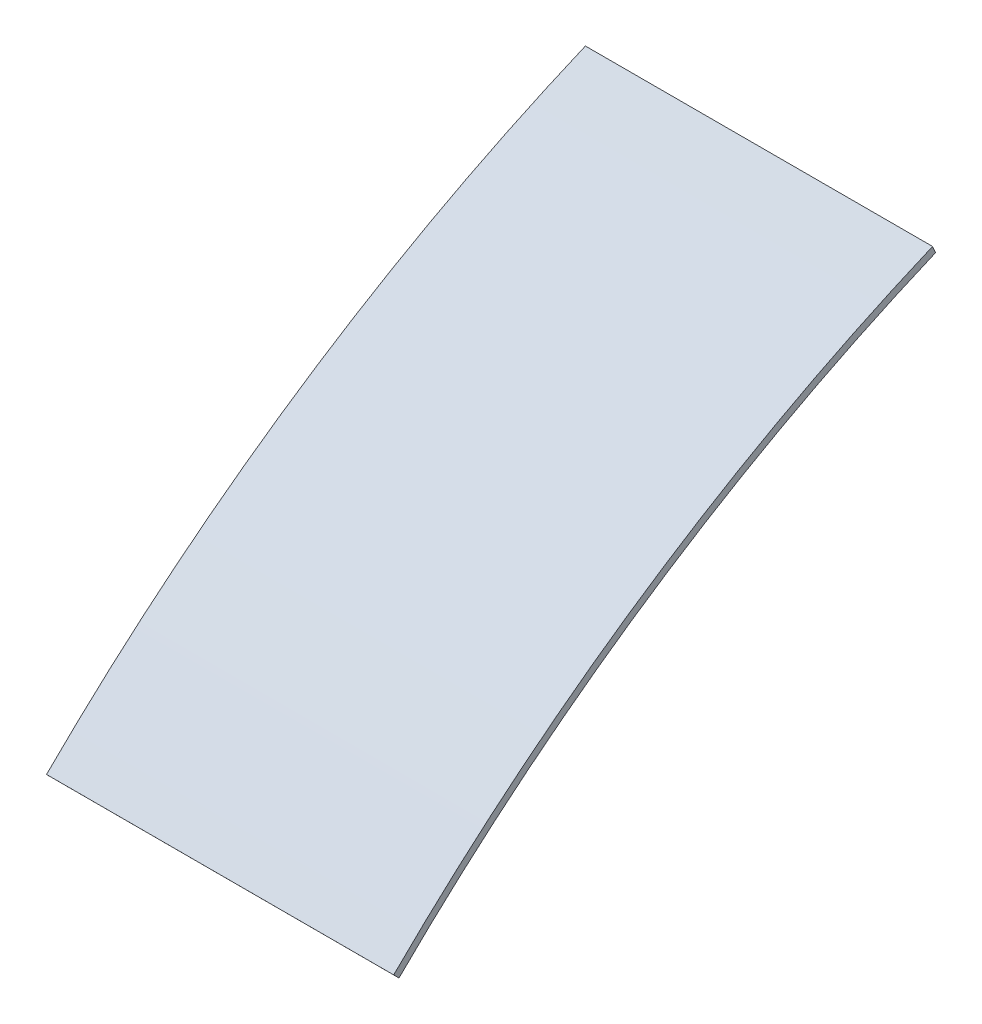
ISO-10303-21;
HEADER;
FILE_DESCRIPTION(('STEP AP214'),'2;1');
FILE_NAME('part.step','',(''),(''),'','','');
FILE_SCHEMA(('AUTOMOTIVE_DESIGN { 1 0 10303 214 1 1 1 1 }'));
ENDSEC;
DATA;
#1=APPLICATION_CONTEXT('core data for automotive mechanical design processes');
#2=APPLICATION_PROTOCOL_DEFINITION('international standard','automotive_design',2000,#1);
#3=PRODUCT_CONTEXT('',#1,'mechanical');
#4=PRODUCT('Part','Part','',(#3));
#5=PRODUCT_RELATED_PRODUCT_CATEGORY('part','',(#4));
#6=PRODUCT_DEFINITION_FORMATION('','',#4);
#7=PRODUCT_DEFINITION_CONTEXT('part definition',#1,'design');
#8=PRODUCT_DEFINITION('design','',#6,#7);
#9=PRODUCT_DEFINITION_SHAPE('','',#8);
#10=(LENGTH_UNIT() NAMED_UNIT(*) SI_UNIT(.MILLI.,.METRE.));
#11=(NAMED_UNIT(*) PLANE_ANGLE_UNIT() SI_UNIT($,.RADIAN.));
#12=(NAMED_UNIT(*) SI_UNIT($,.STERADIAN.) SOLID_ANGLE_UNIT());
#13=UNCERTAINTY_MEASURE_WITH_UNIT(LENGTH_MEASURE(1.E-05),#10,'distance_accuracy_value','');
#14=(GEOMETRIC_REPRESENTATION_CONTEXT(3) GLOBAL_UNCERTAINTY_ASSIGNED_CONTEXT((#13)) GLOBAL_UNIT_ASSIGNED_CONTEXT((#10,
#11,#12)) REPRESENTATION_CONTEXT('',''));
#15=CARTESIAN_POINT('',(0.,0.,0.));
#16=DIRECTION('',(0.,0.,1.));
#17=DIRECTION('',(1.,0.,0.));
#18=AXIS2_PLACEMENT_3D('',#15,#16,#17);
#19=CARTESIAN_POINT('',(73.1012,0.,0.));
#20=DIRECTION('',(0.,0.388415053767305,-0.921484533786076));
#21=DIRECTION('',(0.,0.921484533786076,0.388415053767305));
#22=AXIS2_PLACEMENT_3D('',#19,#20,#21);
#23=PLANE('',#22);
#24=DIRECTION('',(0.,-0.921484533786076,-0.388415053767305));
#25=VECTOR('',#24,1.);
#26=CARTESIAN_POINT('',(-73.1012,0.,0.));
#27=LINE('',#26,#25);
#28=CARTESIAN_POINT('',(-73.1012,0.,0.));
#29=VERTEX_POINT('',#28);
#30=CARTESIAN_POINT('',(-73.1012,-2.92571341417878,-1.23321780389186));
#31=VERTEX_POINT('',#30);
#32=EDGE_CURVE('E109',#29,#31,#27,.T.);
#33=ORIENTED_EDGE('',*,*,#32,.F.);
#34=DIRECTION('',(-1.,0.,0.));
#35=VECTOR('',#34,1.);
#36=CARTESIAN_POINT('',(73.1012,0.,0.));
#37=LINE('',#36,#35);
#38=CARTESIAN_POINT('',(73.1012,0.,0.));
#39=VERTEX_POINT('',#38);
#40=EDGE_CURVE('E11',#39,#29,#37,.T.);
#41=ORIENTED_EDGE('',*,*,#40,.F.);
#42=DIRECTION('',(0.,-0.921484533786076,-0.388415053767305));
#43=VECTOR('',#42,1.);
#44=CARTESIAN_POINT('',(73.1012,0.,0.));
#45=LINE('',#44,#43);
#46=CARTESIAN_POINT('',(73.1012,-2.92571341417878,-1.23321780389186));
#47=VERTEX_POINT('',#46);
#48=EDGE_CURVE('E90',#39,#47,#45,.T.);
#49=ORIENTED_EDGE('',*,*,#48,.T.);
#50=DIRECTION('',(-1.,0.,0.));
#51=VECTOR('',#50,1.);
#52=CARTESIAN_POINT('',(73.1012,-2.92571341417878,-1.23321780389186));
#53=LINE('',#52,#51);
#54=EDGE_CURVE('E58',#47,#31,#53,.T.);
#55=ORIENTED_EDGE('',*,*,#54,.T.);
#56=EDGE_LOOP('',(#33,#41,#49,#55));
#57=FACE_BOUND('',#56,.T.);
#58=ADVANCED_FACE('F41',(#57),#23,.T.);
#59=CARTESIAN_POINT('',(73.1012,-659.827550021312,-278.034785948278));
#60=DIRECTION('',(-1.,0.,0.));
#61=DIRECTION('',(0.,0.,1.));
#62=AXIS2_PLACEMENT_3D('',#59,#60,#61);
#63=CYLINDRICAL_SURFACE('',#62,716.013783362023);
#64=CARTESIAN_POINT('',(-73.1012,-659.827550021312,-278.034785948278));
#65=DIRECTION('',(1.,0.,0.));
#66=DIRECTION('',(0.,0.,-1.));
#67=AXIS2_PLACEMENT_3D('',#64,#65,#66);
#68=CIRCLE('',#67,716.013783362023);
#69=CARTESIAN_POINT('',(-73.1012,-152.19963407122,226.930199879978));
#70=VERTEX_POINT('',#69);
#71=EDGE_CURVE('E97',#29,#70,#68,.T.);
#72=ORIENTED_EDGE('',*,*,#71,.T.);
#73=DIRECTION('',(-1.,0.,0.));
#74=VECTOR('',#73,1.);
#75=CARTESIAN_POINT('',(73.1012,-152.19963407122,226.930199879978));
#76=LINE('',#75,#74);
#77=CARTESIAN_POINT('',(73.1012,-152.19963407122,226.930199879978));
#78=VERTEX_POINT('',#77);
#79=EDGE_CURVE('E50',#78,#70,#76,.T.);
#80=ORIENTED_EDGE('',*,*,#79,.F.);
#81=CARTESIAN_POINT('',(73.1012,-659.827550021312,-278.034785948278));
#82=DIRECTION('',(1.,0.,0.));
#83=DIRECTION('',(0.,0.,-1.));
#84=AXIS2_PLACEMENT_3D('',#81,#82,#83);
#85=CIRCLE('',#84,716.013783362023);
#86=EDGE_CURVE('E84',#39,#78,#85,.T.);
#87=ORIENTED_EDGE('',*,*,#86,.F.);
#88=ORIENTED_EDGE('',*,*,#40,.T.);
#89=EDGE_LOOP('',(#72,#80,#87,#88));
#90=FACE_BOUND('',#89,.T.);
#91=ADVANCED_FACE('F95',(#90),#63,.T.);
#92=CARTESIAN_POINT('',(73.1012,-189.163093726035,190.160644277777));
#93=DIRECTION('',(0.,-0.705244783776678,0.708963888329855));
#94=DIRECTION('',(0.,-0.708963888329855,-0.705244783776678));
#95=AXIS2_PLACEMENT_3D('',#92,#93,#94);
#96=PLANE('',#95);
#97=DIRECTION('',(0.,0.708963888329855,0.705244783776678));
#98=VECTOR('',#97,1.);
#99=CARTESIAN_POINT('',(-73.1012,-189.163093726035,190.160644277777));
#100=LINE('',#99,#98);
#101=CARTESIAN_POINT('',(-73.1012,-154.450594416667,224.691047691488));
#102=VERTEX_POINT('',#101);
#103=EDGE_CURVE('E114',#102,#70,#100,.T.);
#104=ORIENTED_EDGE('',*,*,#103,.F.);
#105=DIRECTION('',(-1.,0.,0.));
#106=VECTOR('',#105,1.);
#107=CARTESIAN_POINT('',(73.1012,-154.450594416667,224.691047691488));
#108=LINE('',#107,#106);
#109=CARTESIAN_POINT('',(73.1012,-154.450594416667,224.691047691488));
#110=VERTEX_POINT('',#109);
#111=EDGE_CURVE('E71',#110,#102,#108,.T.);
#112=ORIENTED_EDGE('',*,*,#111,.F.);
#113=DIRECTION('',(0.,0.708963888329855,0.705244783776678));
#114=VECTOR('',#113,1.);
#115=CARTESIAN_POINT('',(73.1012,-189.163093726035,190.160644277777));
#116=LINE('',#115,#114);
#117=EDGE_CURVE('E89',#110,#78,#116,.T.);
#118=ORIENTED_EDGE('',*,*,#117,.T.);
#119=ORIENTED_EDGE('',*,*,#79,.T.);
#120=EDGE_LOOP('',(#104,#112,#118,#119));
#121=FACE_BOUND('',#120,.T.);
#122=ADVANCED_FACE('F101',(#121),#96,.T.);
#123=CARTESIAN_POINT('',(73.1012,-659.827550021312,-278.034785948278));
#124=DIRECTION('',(-1.,0.,0.));
#125=DIRECTION('',(0.,0.,1.));
#126=AXIS2_PLACEMENT_3D('',#123,#124,#125);
#127=CYLINDRICAL_SURFACE('',#126,712.838783362);
#128=CARTESIAN_POINT('',(-73.1012,-659.827550021312,-278.034785948278));
#129=DIRECTION('',(1.,0.,0.));
#130=DIRECTION('',(0.,0.,-1.));
#131=AXIS2_PLACEMENT_3D('',#128,#129,#130);
#132=CIRCLE('',#131,712.838783362);
#133=EDGE_CURVE('E117',#31,#102,#132,.T.);
#134=ORIENTED_EDGE('',*,*,#133,.F.);
#135=ORIENTED_EDGE('',*,*,#54,.F.);
#136=CARTESIAN_POINT('',(73.1012,-659.827550021312,-278.034785948278));
#137=DIRECTION('',(1.,0.,0.));
#138=DIRECTION('',(0.,0.,-1.));
#139=AXIS2_PLACEMENT_3D('',#136,#137,#138);
#140=CIRCLE('',#139,712.838783362);
#141=EDGE_CURVE('E103',#47,#110,#140,.T.);
#142=ORIENTED_EDGE('',*,*,#141,.T.);
#143=ORIENTED_EDGE('',*,*,#111,.T.);
#144=EDGE_LOOP('',(#134,#135,#142,#143));
#145=FACE_BOUND('',#144,.T.);
#146=ADVANCED_FACE('F126',(#145),#127,.F.);
#147=CARTESIAN_POINT('',(73.1012,0.,0.));
#148=DIRECTION('',(1.,0.,0.));
#149=DIRECTION('',(0.,0.,-1.));
#150=AXIS2_PLACEMENT_3D('',#147,#148,#149);
#151=PLANE('',#150);
#152=ORIENTED_EDGE('',*,*,#48,.F.);
#153=ORIENTED_EDGE('',*,*,#86,.T.);
#154=ORIENTED_EDGE('',*,*,#117,.F.);
#155=ORIENTED_EDGE('',*,*,#141,.F.);
#156=EDGE_LOOP('',(#152,#153,#154,#155));
#157=FACE_BOUND('',#156,.T.);
#158=ADVANCED_FACE('F86',(#157),#151,.T.);
#159=CARTESIAN_POINT('',(-73.1012,0.,0.));
#160=DIRECTION('',(1.,0.,0.));
#161=DIRECTION('',(0.,0.,-1.));
#162=AXIS2_PLACEMENT_3D('',#159,#160,#161);
#163=PLANE('',#162);
#164=ORIENTED_EDGE('',*,*,#32,.T.);
#165=ORIENTED_EDGE('',*,*,#133,.T.);
#166=ORIENTED_EDGE('',*,*,#103,.T.);
#167=ORIENTED_EDGE('',*,*,#71,.F.);
#168=EDGE_LOOP('',(#164,#165,#166,#167));
#169=FACE_BOUND('',#168,.T.);
#170=ADVANCED_FACE('F133',(#169),#163,.F.);
#171=CLOSED_SHELL('',(#58,#91,#122,#146,#158,#170));
#172=MANIFOLD_SOLID_BREP('B2',#171);
#173=ADVANCED_BREP_SHAPE_REPRESENTATION('',(#18,#172),#14);
#174=SHAPE_DEFINITION_REPRESENTATION(#9,#173);
ENDSEC;
END-ISO-10303-21;
